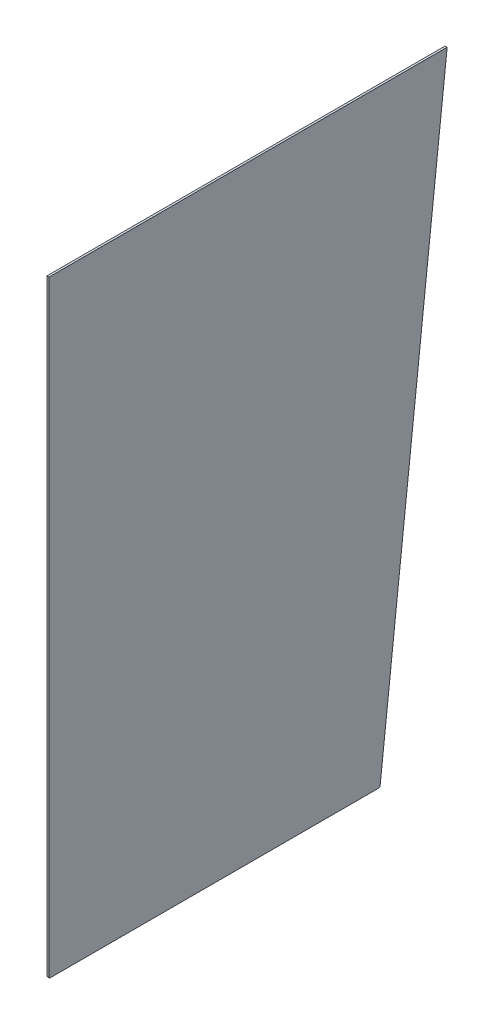
ISO-10303-21;
HEADER;
FILE_DESCRIPTION(('STEP AP214'),'2;1');
FILE_NAME('part.step','',(''),(''),'','','');
FILE_SCHEMA(('AUTOMOTIVE_DESIGN { 1 0 10303 214 1 1 1 1 }'));
ENDSEC;
DATA;
#1=APPLICATION_CONTEXT('core data for automotive mechanical design processes');
#2=APPLICATION_PROTOCOL_DEFINITION('international standard','automotive_design',2000,#1);
#3=PRODUCT_CONTEXT('',#1,'mechanical');
#4=PRODUCT('Part','Part','',(#3));
#5=PRODUCT_RELATED_PRODUCT_CATEGORY('part','',(#4));
#6=PRODUCT_DEFINITION_FORMATION('','',#4);
#7=PRODUCT_DEFINITION_CONTEXT('part definition',#1,'design');
#8=PRODUCT_DEFINITION('design','',#6,#7);
#9=PRODUCT_DEFINITION_SHAPE('','',#8);
#10=(LENGTH_UNIT() NAMED_UNIT(*) SI_UNIT(.MILLI.,.METRE.));
#11=(NAMED_UNIT(*) PLANE_ANGLE_UNIT() SI_UNIT($,.RADIAN.));
#12=(NAMED_UNIT(*) SI_UNIT($,.STERADIAN.) SOLID_ANGLE_UNIT());
#13=UNCERTAINTY_MEASURE_WITH_UNIT(LENGTH_MEASURE(1.E-05),#10,'distance_accuracy_value','');
#14=(GEOMETRIC_REPRESENTATION_CONTEXT(3) GLOBAL_UNCERTAINTY_ASSIGNED_CONTEXT((#13)) GLOBAL_UNIT_ASSIGNED_CONTEXT((#10,
#11,#12)) REPRESENTATION_CONTEXT('',''));
#15=CARTESIAN_POINT('',(0.,0.,0.));
#16=DIRECTION('',(0.,0.,1.));
#17=DIRECTION('',(1.,0.,0.));
#18=AXIS2_PLACEMENT_3D('',#15,#16,#17);
#19=CARTESIAN_POINT('',(1059.57800510978,-270.839230475591,-187.150862618276));
#20=DIRECTION('',(0.998629534754574,-0.0523359562429473,0.));
#21=DIRECTION('',(-0.0523359562429473,-0.998629534754574,0.));
#22=AXIS2_PLACEMENT_3D('',#19,#20,#21);
#23=ELLIPSE('',#22,1.00572655884673,1.);
#24=DIRECTION('',(1.,0.,0.));
#25=VECTOR('',#24,1.);
#26=SURFACE_OF_LINEAR_EXTRUSION('',#23,#25);
#27=CARTESIAN_POINT('',(1061.16275037212,-270.891794001423,-188.14949215303));
#28=CARTESIAN_POINT('',(1061.15514238009,-270.947896303195,-188.14660755008));
#29=CARTESIAN_POINT('',(1061.14756969659,-271.003746856857,-188.138953383228));
#30=CARTESIAN_POINT('',(1061.13270214188,-271.113444260012,-188.114483646236));
#31=CARTESIAN_POINT('',(1061.12540727557,-271.167291074089,-188.097667914251));
#32=CARTESIAN_POINT('',(1061.11133172097,-271.271265316893,-188.055339769602));
#33=CARTESIAN_POINT('',(1061.1045490489,-271.321407077367,-188.029863262129));
#34=CARTESIAN_POINT('',(1061.09169436283,-271.416524342259,-187.97104435865));
#35=CARTESIAN_POINT('',(1061.08561833708,-271.461528980875,-187.937749970895));
#36=CARTESIAN_POINT('',(1061.07433822264,-271.545163305762,-187.864323388931));
#37=CARTESIAN_POINT('',(1061.06912867428,-271.583832884099,-187.824237494944));
#38=CARTESIAN_POINT('',(1061.05970946442,-271.653816595335,-187.738414362958));
#39=CARTESIAN_POINT('',(1061.05549360707,-271.685176292259,-187.692715001154));
#40=CARTESIAN_POINT('',(1061.04815738187,-271.739790148526,-187.596974489556));
#41=CARTESIAN_POINT('',(1061.04503103472,-271.763088543548,-187.546958979348));
#42=CARTESIAN_POINT('',(1061.039806307,-271.802045515985,-187.44122497357));
#43=CARTESIAN_POINT('',(1061.03776382398,-271.817288521168,-187.385348422699));
#44=CARTESIAN_POINT('',(1061.03567198359,-271.832903313672,-187.299308869282));
#45=CARTESIAN_POINT('',(1061.03513642888,-271.836901920913,-187.269771034213));
#46=CARTESIAN_POINT('',(1061.03442155539,-271.842239854628,-187.210448342999));
#47=CARTESIAN_POINT('',(1061.03424227744,-271.843578876268,-187.180663458931));
#48=CARTESIAN_POINT('',(1061.03424226732,-271.843578721142,-187.150862618276));
#49=B_SPLINE_CURVE_WITH_KNOTS('',3,(#27,#28,#29,#30,#31,#32,#33,#34,#35,#36,#37,#38,#39,#40,#41,
#42,#43,#44,#45,#46,#47,#48),.UNSPECIFIED.,.F.,.F.,(4,2,2,2,2,2,2,2,2,2,4),(0.,
0.169860654609331,0.339724310045276,0.508892175790924,0.677047192290528,0.844098847589265,
1.01007959268616,1.17513452463956,1.34803147366722,1.43736156787115,1.52670190027733),.UNSPECIFIED.);
#50=CARTESIAN_POINT('',(1061.16275037212,-270.891794001423,-188.14949215303));
#51=VERTEX_POINT('',#50);
#52=CARTESIAN_POINT('',(1061.03424226732,-271.843578721142,-187.150862618276));
#53=VERTEX_POINT('',#52);
#54=EDGE_CURVE('E123',#51,#53,#49,.T.);
#55=ORIENTED_EDGE('',*,*,#54,.F.);
#56=CARTESIAN_POINT('',(1061.16550510978,-270.839230475591,-187.150862618276));
#57=DIRECTION('',(0.998629534754574,-0.0523359562429473,0.));
#58=DIRECTION('',(-0.0523359562429473,-0.998629534754574,0.));
#59=AXIS2_PLACEMENT_3D('',#56,#57,#58);
#60=ELLIPSE('',#59,1.00572655884673,1.);
#61=CARTESIAN_POINT('',(1061.1128694486,-271.843578721142,-187.150862618276));
#62=VERTEX_POINT('',#61);
#63=EDGE_CURVE('E169',#62,#51,#60,.T.);
#64=ORIENTED_EDGE('',*,*,#63,.F.);
#65=DIRECTION('',(1.,0.,0.));
#66=VECTOR('',#65,1.);
#67=CARTESIAN_POINT('',(1059.5253694486,-271.843578721142,-187.150862618276));
#68=LINE('',#67,#66);
#69=EDGE_CURVE('E83',#53,#62,#68,.T.);
#70=ORIENTED_EDGE('',*,*,#69,.F.);
#71=EDGE_LOOP('',(#55,#64,#70));
#72=FACE_BOUND('',#71,.T.);
#73=ADVANCED_FACE('F37',(#72),#26,.T.);
#74=CARTESIAN_POINT('',(1059.5253694486,-271.843578721142,-187.150862618276));
#75=DIRECTION('',(0.,-1.,0.));
#76=DIRECTION('',(0.,0.,-1.));
#77=AXIS2_PLACEMENT_3D('',#74,#75,#76);
#78=PLANE('',#77);
#79=DIRECTION('',(0.,0.,-1.));
#80=VECTOR('',#79,1.);
#81=CARTESIAN_POINT('',(1061.03424226732,-271.843578721142,-187.150862618276));
#82=LINE('',#81,#80);
#83=CARTESIAN_POINT('',(1061.03424226732,-271.843578721142,60.3663571898702));
#84=VERTEX_POINT('',#83);
#85=EDGE_CURVE('E11',#53,#84,#82,.F.);
#86=ORIENTED_EDGE('',*,*,#85,.F.);
#87=ORIENTED_EDGE('',*,*,#69,.T.);
#88=DIRECTION('',(0.,0.,-1.));
#89=VECTOR('',#88,1.);
#90=CARTESIAN_POINT('',(1061.1128694486,-271.843578721142,-187.150862618276));
#91=LINE('',#90,#89);
#92=CARTESIAN_POINT('',(1061.1128694486,-271.843578721142,60.3663571898702));
#93=VERTEX_POINT('',#92);
#94=EDGE_CURVE('E219',#93,#62,#91,.T.);
#95=ORIENTED_EDGE('',*,*,#94,.F.);
#96=DIRECTION('',(1.,0.,0.));
#97=VECTOR('',#96,1.);
#98=CARTESIAN_POINT('',(1059.5253694486,-271.843578721142,60.3663571898702));
#99=LINE('',#98,#97);
#100=EDGE_CURVE('E76',#84,#93,#99,.T.);
#101=ORIENTED_EDGE('',*,*,#100,.F.);
#102=EDGE_LOOP('',(#86,#87,#95,#101));
#103=FACE_BOUND('',#102,.T.);
#104=ADVANCED_FACE('F187',(#103),#78,.T.);
#105=CARTESIAN_POINT('',(1059.57800510978,-270.839230475591,60.3663571898702));
#106=DIRECTION('',(0.998629534754574,-0.0523359562429473,0.));
#107=DIRECTION('',(-0.0523359562429473,-0.998629534754574,0.));
#108=AXIS2_PLACEMENT_3D('',#105,#106,#107);
#109=ELLIPSE('',#108,1.00572655884673,1.);
#110=DIRECTION('',(1.,0.,0.));
#111=VECTOR('',#110,1.);
#112=SURFACE_OF_LINEAR_EXTRUSION('',#109,#111);
#113=CARTESIAN_POINT('',(1061.03424226732,-271.843578721142,60.3663571898702));
#114=CARTESIAN_POINT('',(1061.03424229191,-271.843578710398,60.3942644818131));
#115=CARTESIAN_POINT('',(1061.03439948706,-271.842404653284,60.4221582327444));
#116=CARTESIAN_POINT('',(1061.03502657253,-271.837722186846,60.4777436240893));
#117=CARTESIAN_POINT('',(1061.03549644134,-271.834213937945,60.5054352782603));
#118=CARTESIAN_POINT('',(1061.03736626154,-271.820255750254,60.5876706136175));
#119=CARTESIAN_POINT('',(1061.03922647628,-271.806371972536,60.6416619842208));
#120=CARTESIAN_POINT('',(1061.04409369843,-271.770075439576,60.7458595553357));
#121=CARTESIAN_POINT('',(1061.04708630778,-271.747769773641,60.7961041679052));
#122=CARTESIAN_POINT('',(1061.05413731078,-271.695268813062,60.8922088370289));
#123=CARTESIAN_POINT('',(1061.05819566578,-271.665073804502,60.938069052488));
#124=CARTESIAN_POINT('',(1061.06726648964,-271.597661957819,61.0241815533495));
#125=CARTESIAN_POINT('',(1061.07227891801,-271.56044541768,61.0644340766082));
#126=CARTESIAN_POINT('',(1061.08312230829,-271.4800263119,61.1382988922703));
#127=CARTESIAN_POINT('',(1061.08895323422,-271.436824009464,61.1719114764869));
#128=CARTESIAN_POINT('',(1061.10127436957,-271.345627455112,61.2316516255773));
#129=CARTESIAN_POINT('',(1061.10776455204,-271.297633398996,61.257779496121));
#130=CARTESIAN_POINT('',(1061.12197479053,-271.192634951664,61.3043326836719));
#131=CARTESIAN_POINT('',(1061.12975178749,-271.135218693749,61.3238256642926));
#132=CARTESIAN_POINT('',(1061.14180264487,-271.046295909875,61.3453689036979));
#133=CARTESIAN_POINT('',(1061.14595560598,-271.015659439775,61.3512969725404));
#134=CARTESIAN_POINT('',(1061.15431829816,-270.953977164902,61.3602931674193));
#135=CARTESIAN_POINT('',(1061.15852802887,-270.922931362671,61.3633613112018));
#136=CARTESIAN_POINT('',(1061.16275037212,-270.891794001422,61.3649867246248));
#137=B_SPLINE_CURVE_WITH_KNOTS('',3,(#113,#114,#115,#116,#117,#118,#119,#120,#121,#122,#123,
#124,#125,#126,#127,#128,#129,#130,#131,#132,#133,#134,#135,#136),.UNSPECIFIED.,.F.,.F.,(4,2,2,
2,2,2,2,2,2,2,2,4),(0.,0.0836699009340219,0.167334052067451,0.333811437390655,0.498239604323953,
0.662661809579692,0.827077038559386,0.991485040179394,1.15588632654884,1.33821215314198,
1.43253710991821,1.5268614813989),.UNSPECIFIED.);
#138=CARTESIAN_POINT('',(1061.16275037212,-270.891794001422,61.3649867246248));
#139=VERTEX_POINT('',#138);
#140=EDGE_CURVE('E150',#84,#139,#137,.T.);
#141=ORIENTED_EDGE('',*,*,#140,.F.);
#142=ORIENTED_EDGE('',*,*,#100,.T.);
#143=CARTESIAN_POINT('',(1061.16550510978,-270.839230475591,60.3663571898702));
#144=DIRECTION('',(0.998629534754574,-0.0523359562429473,0.));
#145=DIRECTION('',(-0.0523359562429473,-0.998629534754574,0.));
#146=AXIS2_PLACEMENT_3D('',#143,#144,#145);
#147=ELLIPSE('',#146,1.00572655884673,1.);
#148=EDGE_CURVE('E220',#139,#93,#147,.T.);
#149=ORIENTED_EDGE('',*,*,#148,.F.);
#150=EDGE_LOOP('',(#141,#142,#149));
#151=FACE_BOUND('',#150,.T.);
#152=ADVANCED_FACE('F181',(#151),#112,.T.);
#153=CARTESIAN_POINT('',(1084.83676093329,211.126541954821,86.6264972857977));
#154=DIRECTION('',(0.,-0.0523359562429424,0.998629534754574));
#155=DIRECTION('',(0.,-0.998629534754574,-0.0523359562429424));
#156=AXIS2_PLACEMENT_3D('',#153,#154,#155);
#157=PLANE('',#156);
#158=DIRECTION('',(-0.0522644276887175,-0.997264688634237,-0.0522644276887125));
#159=VECTOR('',#158,1.);
#160=CARTESIAN_POINT('',(1086.42426093329,211.126541954821,86.6264972857977));
#161=LINE('',#160,#159);
#162=CARTESIAN_POINT('',(1086.42426093329,211.126541954821,86.6264972857977));
#163=VERTEX_POINT('',#162);
#164=EDGE_CURVE('E222',#163,#139,#161,.T.);
#165=ORIENTED_EDGE('',*,*,#164,.F.);
#166=DIRECTION('',(1.,0.,0.));
#167=VECTOR('',#166,1.);
#168=CARTESIAN_POINT('',(1084.83676093329,211.126541954821,86.6264972857977));
#169=LINE('',#168,#167);
#170=CARTESIAN_POINT('',(1084.83676093329,211.126541954821,86.6264972857977));
#171=VERTEX_POINT('',#170);
#172=EDGE_CURVE('E228',#171,#163,#169,.T.);
#173=ORIENTED_EDGE('',*,*,#172,.F.);
#174=DIRECTION('',(-0.0522644276887175,-0.997264688634237,-0.0522644276887125));
#175=VECTOR('',#174,1.);
#176=CARTESIAN_POINT('',(1084.83676093329,211.126541954821,86.6264972857977));
#177=LINE('',#176,#175);
#178=CARTESIAN_POINT('',(1059.57525037212,-270.891794001422,61.3649867246248));
#179=VERTEX_POINT('',#178);
#180=EDGE_CURVE('E176',#171,#179,#177,.T.);
#181=ORIENTED_EDGE('',*,*,#180,.T.);
#182=DIRECTION('',(-1.,0.,0.));
#183=VECTOR('',#182,1.);
#184=CARTESIAN_POINT('',(1086.42861514614,-270.891794001422,61.3649867246248));
#185=LINE('',#184,#183);
#186=EDGE_CURVE('E57',#139,#179,#185,.T.);
#187=ORIENTED_EDGE('',*,*,#186,.F.);
#188=EDGE_LOOP('',(#165,#173,#181,#187));
#189=FACE_BOUND('',#188,.T.);
#190=ADVANCED_FACE('F186',(#189),#157,.T.);
#191=CARTESIAN_POINT('',(1084.83676093329,211.126541954821,86.6264972857977));
#192=DIRECTION('',(0.,1.,0.));
#193=DIRECTION('',(0.,0.,1.));
#194=AXIS2_PLACEMENT_3D('',#191,#192,#193);
#195=PLANE('',#194);
#196=DIRECTION('',(0.,0.,1.));
#197=VECTOR('',#196,1.);
#198=CARTESIAN_POINT('',(1086.42426093329,211.126541954821,86.6264972857977));
#199=LINE('',#198,#197);
#200=CARTESIAN_POINT('',(1086.4242609333,211.126541954821,-213.411002714203));
#201=VERTEX_POINT('',#200);
#202=EDGE_CURVE('E218',#201,#163,#199,.T.);
#203=ORIENTED_EDGE('',*,*,#202,.F.);
#204=DIRECTION('',(1.,0.,0.));
#205=VECTOR('',#204,1.);
#206=CARTESIAN_POINT('',(1084.8367609333,211.126541954821,-213.411002714203));
#207=LINE('',#206,#205);
#208=CARTESIAN_POINT('',(1084.8367609333,211.126541954821,-213.411002714203));
#209=VERTEX_POINT('',#208);
#210=EDGE_CURVE('E89',#209,#201,#207,.T.);
#211=ORIENTED_EDGE('',*,*,#210,.F.);
#212=DIRECTION('',(0.,0.,1.));
#213=VECTOR('',#212,1.);
#214=CARTESIAN_POINT('',(1084.83676093329,211.126541954821,86.6264972857977));
#215=LINE('',#214,#213);
#216=EDGE_CURVE('E174',#209,#171,#215,.T.);
#217=ORIENTED_EDGE('',*,*,#216,.T.);
#218=ORIENTED_EDGE('',*,*,#172,.T.);
#219=EDGE_LOOP('',(#203,#211,#217,#218));
#220=FACE_BOUND('',#219,.T.);
#221=ADVANCED_FACE('F191',(#220),#195,.T.);
#222=CARTESIAN_POINT('',(1059.57525037212,-270.891794001423,-188.14949215303));
#223=DIRECTION('',(0.,-0.052335956242943,-0.998629534754574));
#224=DIRECTION('',(0.,0.998629534754574,-0.052335956242943));
#225=AXIS2_PLACEMENT_3D('',#222,#223,#224);
#226=PLANE('',#225);
#227=DIRECTION('',(0.0522644276887175,0.997264688634237,-0.0522644276887131));
#228=VECTOR('',#227,1.);
#229=CARTESIAN_POINT('',(1061.16275037212,-270.891794001423,-188.14949215303));
#230=LINE('',#229,#228);
#231=EDGE_CURVE('E213',#51,#201,#230,.T.);
#232=ORIENTED_EDGE('',*,*,#231,.F.);
#233=DIRECTION('',(-1.,0.,0.));
#234=VECTOR('',#233,1.);
#235=CARTESIAN_POINT('',(1086.42861514614,-270.891794001423,-188.14949215303));
#236=LINE('',#235,#234);
#237=CARTESIAN_POINT('',(1059.57525037212,-270.891794001423,-188.14949215303));
#238=VERTEX_POINT('',#237);
#239=EDGE_CURVE('E135',#51,#238,#236,.T.);
#240=ORIENTED_EDGE('',*,*,#239,.T.);
#241=DIRECTION('',(0.0522644276887175,0.997264688634237,-0.0522644276887131));
#242=VECTOR('',#241,1.);
#243=CARTESIAN_POINT('',(1059.57525037212,-270.891794001423,-188.14949215303));
#244=LINE('',#243,#242);
#245=EDGE_CURVE('E177',#238,#209,#244,.T.);
#246=ORIENTED_EDGE('',*,*,#245,.T.);
#247=ORIENTED_EDGE('',*,*,#210,.T.);
#248=EDGE_LOOP('',(#232,#240,#246,#247));
#249=FACE_BOUND('',#248,.T.);
#250=ADVANCED_FACE('F194',(#249),#226,.T.);
#251=CARTESIAN_POINT('',(1059.57800510978,-270.839230475591,-187.150862618276));
#252=DIRECTION('',(0.998629534754574,-0.0523359562429473,0.));
#253=DIRECTION('',(0.0523359562429473,0.998629534754574,0.));
#254=AXIS2_PLACEMENT_3D('',#251,#252,#253);
#255=PLANE('',#254);
#256=ORIENTED_EDGE('',*,*,#245,.F.);
#257=CARTESIAN_POINT('',(1059.57799318336,-270.83945804518,-187.150862618276));
#258=DIRECTION('',(0.998629534754574,-0.0523359562429473,0.));
#259=DIRECTION('',(-0.0523359562429473,-0.998629534754574,0.));
#260=AXIS2_PLACEMENT_3D('',#257,#258,#259);
#261=ELLIPSE('',#260,1.00137234599792,1.);
#262=CARTESIAN_POINT('',(1059.52558540408,-271.83945804518,-187.150862618275));
#263=VERTEX_POINT('',#262);
#264=EDGE_CURVE('E167',#238,#263,#261,.F.);
#265=ORIENTED_EDGE('',*,*,#264,.T.);
#266=DIRECTION('',(0.,0.,1.));
#267=VECTOR('',#266,1.);
#268=CARTESIAN_POINT('',(1059.52558540408,-271.83945804518,-187.150862618276));
#269=LINE('',#268,#267);
#270=CARTESIAN_POINT('',(1059.52558540408,-271.83945804518,60.3663571898702));
#271=VERTEX_POINT('',#270);
#272=EDGE_CURVE('E48',#263,#271,#269,.T.);
#273=ORIENTED_EDGE('',*,*,#272,.T.);
#274=CARTESIAN_POINT('',(1059.57799318336,-270.83945804518,60.3663571898702));
#275=DIRECTION('',(0.998629534754574,-0.0523359562429473,0.));
#276=DIRECTION('',(-0.0523359562429473,-0.998629534754574,0.));
#277=AXIS2_PLACEMENT_3D('',#274,#275,#276);
#278=ELLIPSE('',#277,1.00137234599792,1.);
#279=EDGE_CURVE('E170',#271,#179,#278,.F.);
#280=ORIENTED_EDGE('',*,*,#279,.T.);
#281=ORIENTED_EDGE('',*,*,#180,.F.);
#282=ORIENTED_EDGE('',*,*,#216,.F.);
#283=EDGE_LOOP('',(#256,#265,#273,#280,#281,#282));
#284=FACE_BOUND('',#283,.T.);
#285=ADVANCED_FACE('F196',(#284),#255,.F.);
#286=CARTESIAN_POINT('',(1061.16550510978,-270.839230475591,-187.150862618276));
#287=DIRECTION('',(0.998629534754574,-0.0523359562429473,0.));
#288=DIRECTION('',(0.0523359562429473,0.998629534754574,0.));
#289=AXIS2_PLACEMENT_3D('',#286,#287,#288);
#290=PLANE('',#289);
#291=ORIENTED_EDGE('',*,*,#63,.T.);
#292=ORIENTED_EDGE('',*,*,#231,.T.);
#293=ORIENTED_EDGE('',*,*,#202,.T.);
#294=ORIENTED_EDGE('',*,*,#164,.T.);
#295=ORIENTED_EDGE('',*,*,#148,.T.);
#296=ORIENTED_EDGE('',*,*,#94,.T.);
#297=EDGE_LOOP('',(#291,#292,#293,#294,#295,#296));
#298=FACE_BOUND('',#297,.T.);
#299=ADVANCED_FACE('F201',(#298),#290,.T.);
#300=CARTESIAN_POINT('',(1086.42861514614,-271.83945804518,61.3153217565851));
#301=DIRECTION('',(0.,1.,0.));
#302=DIRECTION('',(0.,0.,1.));
#303=AXIS2_PLACEMENT_3D('',#300,#301,#302);
#304=PLANE('',#303);
#305=DIRECTION('',(-1.,0.,0.));
#306=VECTOR('',#305,1.);
#307=CARTESIAN_POINT('',(1086.42861514614,-271.83945804518,-187.150862618275));
#308=LINE('',#307,#306);
#309=CARTESIAN_POINT('',(1061.03424226732,-271.83945804518,-187.150862618276));
#310=VERTEX_POINT('',#309);
#311=EDGE_CURVE('E132',#310,#263,#308,.T.);
#312=ORIENTED_EDGE('',*,*,#311,.F.);
#313=DIRECTION('',(0.,0.,1.));
#314=VECTOR('',#313,1.);
#315=CARTESIAN_POINT('',(1061.03424226732,-271.83945804518,61.3153217565851));
#316=LINE('',#315,#314);
#317=CARTESIAN_POINT('',(1061.03424226732,-271.83945804518,60.3663571898702));
#318=VERTEX_POINT('',#317);
#319=EDGE_CURVE('E139',#310,#318,#316,.T.);
#320=ORIENTED_EDGE('',*,*,#319,.T.);
#321=DIRECTION('',(-1.,0.,0.));
#322=VECTOR('',#321,1.);
#323=CARTESIAN_POINT('',(1086.42861514614,-271.83945804518,60.3663571898702));
#324=LINE('',#323,#322);
#325=EDGE_CURVE('E148',#318,#271,#324,.T.);
#326=ORIENTED_EDGE('',*,*,#325,.T.);
#327=ORIENTED_EDGE('',*,*,#272,.F.);
#328=EDGE_LOOP('',(#312,#320,#326,#327));
#329=FACE_BOUND('',#328,.T.);
#330=ADVANCED_FACE('F146',(#329),#304,.F.);
#331=CARTESIAN_POINT('',(1086.42861514614,-270.83945804518,-187.150862618276));
#332=DIRECTION('',(-1.,0.,0.));
#333=DIRECTION('',(0.,0.,1.));
#334=AXIS2_PLACEMENT_3D('',#331,#332,#333);
#335=CYLINDRICAL_SURFACE('',#334,1.);
#336=ORIENTED_EDGE('',*,*,#239,.F.);
#337=CARTESIAN_POINT('',(1061.16984739621,-270.83945804518,-187.150862618276));
#338=DIRECTION('',(0.990930516924706,-0.134375260473553,0.));
#339=DIRECTION('',(-0.134375260473553,-0.990930516924706,0.));
#340=AXIS2_PLACEMENT_3D('',#337,#338,#339);
#341=ELLIPSE('',#340,1.00915249144152,1.);
#342=EDGE_CURVE('E120',#310,#51,#341,.T.);
#343=ORIENTED_EDGE('',*,*,#342,.F.);
#344=ORIENTED_EDGE('',*,*,#311,.T.);
#345=ORIENTED_EDGE('',*,*,#264,.F.);
#346=EDGE_LOOP('',(#336,#343,#344,#345));
#347=FACE_BOUND('',#346,.T.);
#348=ADVANCED_FACE('F130',(#347),#335,.T.);
#349=CARTESIAN_POINT('',(1086.42861514614,-270.83945804518,60.3663571898702));
#350=DIRECTION('',(-1.,0.,0.));
#351=DIRECTION('',(0.,0.,1.));
#352=AXIS2_PLACEMENT_3D('',#349,#350,#351);
#353=CYLINDRICAL_SURFACE('',#352,1.);
#354=ORIENTED_EDGE('',*,*,#325,.F.);
#355=CARTESIAN_POINT('',(1061.16984739621,-270.83945804518,60.3663571898702));
#356=DIRECTION('',(0.990930516924706,-0.134375260473553,0.));
#357=DIRECTION('',(-0.134375260473553,-0.990930516924706,0.));
#358=AXIS2_PLACEMENT_3D('',#355,#356,#357);
#359=ELLIPSE('',#358,1.00915249144152,1.);
#360=EDGE_CURVE('E136',#139,#318,#359,.T.);
#361=ORIENTED_EDGE('',*,*,#360,.F.);
#362=ORIENTED_EDGE('',*,*,#186,.T.);
#363=ORIENTED_EDGE('',*,*,#279,.F.);
#364=EDGE_LOOP('',(#354,#361,#362,#363));
#365=FACE_BOUND('',#364,.T.);
#366=ADVANCED_FACE('F242',(#365),#353,.T.);
#367=CARTESIAN_POINT('',(1061.03424226732,-271.83945804518,-187.150862618276));
#368=CARTESIAN_POINT('',(1061.03424226732,-272.368624711846,-187.150862618276));
#369=CARTESIAN_POINT('',(1061.03424226732,-272.897791378513,-187.150862618276));
#370=CARTESIAN_POINT('',(1061.03424226732,-273.42695804518,-187.150862618276));
#371=CARTESIAN_POINT('',(1061.03424226732,-271.83945804518,-189.150862618276));
#372=CARTESIAN_POINT('',(1061.03424226732,-272.368624711846,-190.209195951609));
#373=CARTESIAN_POINT('',(1061.03424226732,-272.897791378513,-191.267529284942));
#374=CARTESIAN_POINT('',(1061.03424226732,-273.42695804518,-192.325862618276));
#375=CARTESIAN_POINT('',(1061.30545252511,-269.83945804518,-189.150862618276));
#376=CARTESIAN_POINT('',(1061.30545252511,-269.310291378513,-190.209195951609));
#377=CARTESIAN_POINT('',(1061.30545252511,-268.781124711846,-191.267529284942));
#378=CARTESIAN_POINT('',(1061.30545252511,-268.25195804518,-192.325862618276));
#379=CARTESIAN_POINT('',(1061.30545252511,-269.83945804518,-187.150862618276));
#380=CARTESIAN_POINT('',(1061.30545252511,-269.310291378513,-187.150862618276));
#381=CARTESIAN_POINT('',(1061.30545252511,-268.781124711846,-187.150862618276));
#382=CARTESIAN_POINT('',(1061.30545252511,-268.25195804518,-187.150862618276));
#383=CARTESIAN_POINT('',(1061.30545252511,-269.83945804518,-185.150862618276));
#384=CARTESIAN_POINT('',(1061.30545252511,-269.310291378513,-184.092529284942));
#385=CARTESIAN_POINT('',(1061.30545252511,-268.781124711846,-183.034195951609));
#386=CARTESIAN_POINT('',(1061.30545252511,-268.25195804518,-181.975862618276));
#387=CARTESIAN_POINT('',(1061.03424226732,-271.83945804518,-185.150862618276));
#388=CARTESIAN_POINT('',(1061.03424226732,-272.368624711846,-184.092529284942));
#389=CARTESIAN_POINT('',(1061.03424226732,-272.897791378513,-183.034195951609));
#390=CARTESIAN_POINT('',(1061.03424226732,-273.42695804518,-181.975862618276));
#391=CARTESIAN_POINT('',(1061.03424226732,-271.83945804518,-187.150862618276));
#392=CARTESIAN_POINT('',(1061.03424226732,-272.368624711846,-187.150862618276));
#393=CARTESIAN_POINT('',(1061.03424226732,-272.897791378513,-187.150862618276));
#394=CARTESIAN_POINT('',(1061.03424226732,-273.42695804518,-187.150862618276));
#395=(BOUNDED_SURFACE() B_SPLINE_SURFACE(3,3,((#367,#368,#369,#370),(#371,#372,#373,#374),(#375,
#376,#377,#378),(#379,#380,#381,#382),(#383,#384,#385,#386),(#387,#388,#389,#390),(#391,#392,
#393,#394)),.UNSPECIFIED.,.T.,.F.,.F.) B_SPLINE_SURFACE_WITH_KNOTS((4,3,4),(4,4),(0.,0.5,1.),
(0.,1.),.UNSPECIFIED.) GEOMETRIC_REPRESENTATION_ITEM() RATIONAL_B_SPLINE_SURFACE(((1.,1.,1.,1.),
(0.333333333333333,0.333333333333333,0.333333333333333,0.333333333333333),(0.333333333333333,
0.333333333333333,0.333333333333333,0.333333333333333),(1.,1.,1.,1.),(0.333333333333333,
0.333333333333333,0.333333333333333,0.333333333333333),(0.333333333333333,0.333333333333333,
0.333333333333333,0.333333333333333),(1.,1.,1.,1.))) REPRESENTATION_ITEM('') SURFACE());
#396=DIRECTION('',(0.,-1.,0.));
#397=VECTOR('',#396,1.);
#398=CARTESIAN_POINT('',(1061.03424226732,-273.42695804518,-187.150862618276));
#399=LINE('',#398,#397);
#400=EDGE_CURVE('E117',#53,#310,#399,.F.);
#401=ORIENTED_EDGE('',*,*,#54,.T.);
#402=ORIENTED_EDGE('',*,*,#400,.T.);
#403=ORIENTED_EDGE('',*,*,#342,.T.);
#404=EDGE_LOOP('',(#401,#402,#403));
#405=FACE_BOUND('',#404,.T.);
#406=ADVANCED_FACE('F119',(#405),#395,.T.);
#407=CARTESIAN_POINT('',(1061.03424226732,-273.42695804518,-214.996327100626));
#408=DIRECTION('',(-1.,0.,0.));
#409=DIRECTION('',(0.,0.,1.));
#410=AXIS2_PLACEMENT_3D('',#407,#408,#409);
#411=PLANE('',#410);
#412=ORIENTED_EDGE('',*,*,#85,.T.);
#413=DIRECTION('',(0.,-1.,0.));
#414=VECTOR('',#413,1.);
#415=CARTESIAN_POINT('',(1061.03424226732,-273.42695804518,60.3663571898702));
#416=LINE('',#415,#414);
#417=EDGE_CURVE('E126',#84,#318,#416,.F.);
#418=ORIENTED_EDGE('',*,*,#417,.T.);
#419=ORIENTED_EDGE('',*,*,#319,.F.);
#420=ORIENTED_EDGE('',*,*,#400,.F.);
#421=EDGE_LOOP('',(#412,#418,#419,#420));
#422=FACE_BOUND('',#421,.T.);
#423=ADVANCED_FACE('F140',(#422),#411,.T.);
#424=CARTESIAN_POINT('',(1061.03424226732,-271.83945804518,60.3663571898702));
#425=CARTESIAN_POINT('',(1061.03424226732,-272.368624711846,60.3663571898702));
#426=CARTESIAN_POINT('',(1061.03424226732,-272.897791378513,60.3663571898702));
#427=CARTESIAN_POINT('',(1061.03424226732,-273.42695804518,60.3663571898702));
#428=CARTESIAN_POINT('',(1061.03424226732,-271.83945804518,58.3663571898702));
#429=CARTESIAN_POINT('',(1061.03424226732,-272.368624711846,57.3080238565368));
#430=CARTESIAN_POINT('',(1061.03424226732,-272.897791378513,56.2496905232035));
#431=CARTESIAN_POINT('',(1061.03424226732,-273.42695804518,55.1913571898702));
#432=CARTESIAN_POINT('',(1061.30545252511,-269.83945804518,58.3663571898702));
#433=CARTESIAN_POINT('',(1061.30545252511,-269.310291378513,57.3080238565368));
#434=CARTESIAN_POINT('',(1061.30545252511,-268.781124711846,56.2496905232035));
#435=CARTESIAN_POINT('',(1061.30545252511,-268.25195804518,55.1913571898702));
#436=CARTESIAN_POINT('',(1061.30545252511,-269.83945804518,60.3663571898702));
#437=CARTESIAN_POINT('',(1061.30545252511,-269.310291378513,60.3663571898702));
#438=CARTESIAN_POINT('',(1061.30545252511,-268.781124711846,60.3663571898702));
#439=CARTESIAN_POINT('',(1061.30545252511,-268.25195804518,60.3663571898702));
#440=CARTESIAN_POINT('',(1061.30545252511,-269.83945804518,62.3663571898702));
#441=CARTESIAN_POINT('',(1061.30545252511,-269.310291378513,63.4246905232035));
#442=CARTESIAN_POINT('',(1061.30545252511,-268.781124711846,64.4830238565368));
#443=CARTESIAN_POINT('',(1061.30545252511,-268.25195804518,65.5413571898702));
#444=CARTESIAN_POINT('',(1061.03424226732,-271.83945804518,62.3663571898702));
#445=CARTESIAN_POINT('',(1061.03424226732,-272.368624711846,63.4246905232035));
#446=CARTESIAN_POINT('',(1061.03424226732,-272.897791378513,64.4830238565368));
#447=CARTESIAN_POINT('',(1061.03424226732,-273.42695804518,65.5413571898702));
#448=CARTESIAN_POINT('',(1061.03424226732,-271.83945804518,60.3663571898702));
#449=CARTESIAN_POINT('',(1061.03424226732,-272.368624711846,60.3663571898702));
#450=CARTESIAN_POINT('',(1061.03424226732,-272.897791378513,60.3663571898702));
#451=CARTESIAN_POINT('',(1061.03424226732,-273.42695804518,60.3663571898702));
#452=(BOUNDED_SURFACE() B_SPLINE_SURFACE(3,3,((#424,#425,#426,#427),(#428,#429,#430,#431),(#432,
#433,#434,#435),(#436,#437,#438,#439),(#440,#441,#442,#443),(#444,#445,#446,#447),(#448,#449,
#450,#451)),.UNSPECIFIED.,.T.,.F.,.F.) B_SPLINE_SURFACE_WITH_KNOTS((4,3,4),(4,4),(0.,0.5,1.),
(0.,1.),.UNSPECIFIED.) GEOMETRIC_REPRESENTATION_ITEM() RATIONAL_B_SPLINE_SURFACE(((1.,1.,1.,1.),
(0.333333333333333,0.333333333333333,0.333333333333333,0.333333333333333),(0.333333333333333,
0.333333333333333,0.333333333333333,0.333333333333333),(1.,1.,1.,1.),(0.333333333333333,
0.333333333333333,0.333333333333333,0.333333333333333),(0.333333333333333,0.333333333333333,
0.333333333333333,0.333333333333333),(1.,1.,1.,1.))) REPRESENTATION_ITEM('') SURFACE());
#453=ORIENTED_EDGE('',*,*,#140,.T.);
#454=ORIENTED_EDGE('',*,*,#360,.T.);
#455=ORIENTED_EDGE('',*,*,#417,.F.);
#456=EDGE_LOOP('',(#453,#454,#455));
#457=FACE_BOUND('',#456,.T.);
#458=ADVANCED_FACE('F240',(#457),#452,.T.);
#459=CLOSED_SHELL('',(#73,#104,#152,#190,#221,#250,#285,#299,#330,#348,#366,#406,#423,#458));
#460=MANIFOLD_SOLID_BREP('B2',#459);
#461=ADVANCED_BREP_SHAPE_REPRESENTATION('',(#18,#460),#14);
#462=SHAPE_DEFINITION_REPRESENTATION(#9,#461);
ENDSEC;
END-ISO-10303-21;
